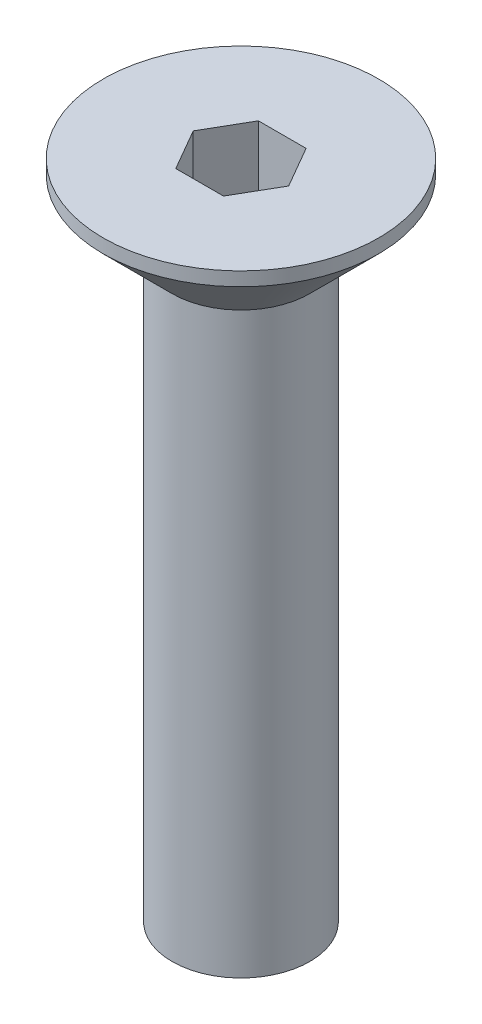
ISO-10303-21;
HEADER;
FILE_DESCRIPTION(('STEP AP214'),'2;1');
FILE_NAME('part.step','',(''),(''),'','','');
FILE_SCHEMA(('AUTOMOTIVE_DESIGN { 1 0 10303 214 1 1 1 1 }'));
ENDSEC;
DATA;
#1=APPLICATION_CONTEXT('core data for automotive mechanical design processes');
#2=APPLICATION_PROTOCOL_DEFINITION('international standard','automotive_design',2000,#1);
#3=PRODUCT_CONTEXT('',#1,'mechanical');
#4=PRODUCT('Part','Part','',(#3));
#5=PRODUCT_RELATED_PRODUCT_CATEGORY('part','',(#4));
#6=PRODUCT_DEFINITION_FORMATION('','',#4);
#7=PRODUCT_DEFINITION_CONTEXT('part definition',#1,'design');
#8=PRODUCT_DEFINITION('design','',#6,#7);
#9=PRODUCT_DEFINITION_SHAPE('','',#8);
#10=(LENGTH_UNIT() NAMED_UNIT(*) SI_UNIT(.MILLI.,.METRE.));
#11=(NAMED_UNIT(*) PLANE_ANGLE_UNIT() SI_UNIT($,.RADIAN.));
#12=(NAMED_UNIT(*) SI_UNIT($,.STERADIAN.) SOLID_ANGLE_UNIT());
#13=UNCERTAINTY_MEASURE_WITH_UNIT(LENGTH_MEASURE(1.E-05),#10,'distance_accuracy_value','');
#14=(GEOMETRIC_REPRESENTATION_CONTEXT(3) GLOBAL_UNCERTAINTY_ASSIGNED_CONTEXT((#13)) GLOBAL_UNIT_ASSIGNED_CONTEXT((#10,
#11,#12)) REPRESENTATION_CONTEXT('',''));
#15=CARTESIAN_POINT('',(0.,0.,0.));
#16=DIRECTION('',(0.,0.,1.));
#17=DIRECTION('',(1.,0.,0.));
#18=AXIS2_PLACEMENT_3D('',#15,#16,#17);
#19=CARTESIAN_POINT('',(2.50000000000001,0.,0.));
#20=DIRECTION('',(0.,-1.,0.));
#21=DIRECTION('',(0.,0.,-1.));
#22=AXIS2_PLACEMENT_3D('',#19,#20,#21);
#23=PLANE('',#22);
#24=DIRECTION('',(-1.,0.,0.));
#25=VECTOR('',#24,1.);
#26=CARTESIAN_POINT('',(0.433012701892219,0.,-0.75));
#27=LINE('',#26,#25);
#28=CARTESIAN_POINT('',(0.433012701892219,0.,-0.75));
#29=VERTEX_POINT('',#28);
#30=CARTESIAN_POINT('',(-0.433012701892219,0.,-0.75));
#31=VERTEX_POINT('',#30);
#32=EDGE_CURVE('E122',#29,#31,#27,.T.);
#33=ORIENTED_EDGE('',*,*,#32,.F.);
#34=DIRECTION('',(-0.5,0.,-0.866025403784438));
#35=VECTOR('',#34,1.);
#36=CARTESIAN_POINT('',(0.866025403784439,0.,0.));
#37=LINE('',#36,#35);
#38=CARTESIAN_POINT('',(0.866025403784439,0.,0.));
#39=VERTEX_POINT('',#38);
#40=EDGE_CURVE('E48',#39,#29,#37,.T.);
#41=ORIENTED_EDGE('',*,*,#40,.F.);
#42=DIRECTION('',(0.5,0.,-0.866025403784439));
#43=VECTOR('',#42,1.);
#44=CARTESIAN_POINT('',(0.43301270189222,0.,0.75));
#45=LINE('',#44,#43);
#46=CARTESIAN_POINT('',(0.43301270189222,0.,0.75));
#47=VERTEX_POINT('',#46);
#48=EDGE_CURVE('E131',#47,#39,#45,.T.);
#49=ORIENTED_EDGE('',*,*,#48,.F.);
#50=DIRECTION('',(1.,0.,0.));
#51=VECTOR('',#50,1.);
#52=CARTESIAN_POINT('',(-0.433012701892219,0.,0.75));
#53=LINE('',#52,#51);
#54=CARTESIAN_POINT('',(-0.433012701892219,0.,0.75));
#55=VERTEX_POINT('',#54);
#56=EDGE_CURVE('E129',#55,#47,#53,.T.);
#57=ORIENTED_EDGE('',*,*,#56,.F.);
#58=DIRECTION('',(0.5,0.,0.866025403784438));
#59=VECTOR('',#58,1.);
#60=CARTESIAN_POINT('',(-0.866025403784438,0.,0.));
#61=LINE('',#60,#59);
#62=CARTESIAN_POINT('',(-0.866025403784438,0.,0.));
#63=VERTEX_POINT('',#62);
#64=EDGE_CURVE('E96',#63,#55,#61,.T.);
#65=ORIENTED_EDGE('',*,*,#64,.F.);
#66=DIRECTION('',(-0.5,0.,0.866025403784439));
#67=VECTOR('',#66,1.);
#68=CARTESIAN_POINT('',(-0.433012701892219,0.,-0.75));
#69=LINE('',#68,#67);
#70=EDGE_CURVE('E125',#31,#63,#69,.T.);
#71=ORIENTED_EDGE('',*,*,#70,.F.);
#72=EDGE_LOOP('',(#33,#41,#49,#57,#65,#71));
#73=FACE_BOUND('',#72,.T.);
#74=CARTESIAN_POINT('',(0.,0.,0.));
#75=DIRECTION('',(0.,1.,0.));
#76=DIRECTION('',(0.,0.,1.));
#77=AXIS2_PLACEMENT_3D('',#74,#75,#76);
#78=CIRCLE('',#77,2.50000000000001);
#79=CARTESIAN_POINT('',(0.,0.,2.50000000000001));
#80=VERTEX_POINT('',#79);
#81=EDGE_CURVE('E11',#80,#80,#78,.T.);
#82=ORIENTED_EDGE('',*,*,#81,.T.);
#83=EDGE_LOOP('',(#82));
#84=FACE_BOUND('',#83,.T.);
#85=ADVANCED_FACE('F34',(#73,#84),#23,.F.);
#86=CARTESIAN_POINT('',(0.,61.6916426261037,0.));
#87=DIRECTION('',(0.,1.,0.));
#88=DIRECTION('',(0.,0.,1.));
#89=AXIS2_PLACEMENT_3D('',#86,#87,#88);
#90=CYLINDRICAL_SURFACE('',#89,2.50000000000001);
#91=ORIENTED_EDGE('',*,*,#81,.F.);
#92=EDGE_LOOP('',(#91));
#93=FACE_BOUND('',#92,.T.);
#94=CARTESIAN_POINT('',(0.,-0.249999999999986,0.));
#95=DIRECTION('',(0.,1.,0.));
#96=DIRECTION('',(0.,0.,1.));
#97=AXIS2_PLACEMENT_3D('',#94,#95,#96);
#98=CIRCLE('',#97,2.50000000000002);
#99=CARTESIAN_POINT('',(0.,-0.249999999999986,2.50000000000002));
#100=VERTEX_POINT('',#99);
#101=EDGE_CURVE('E41',#100,#100,#98,.T.);
#102=ORIENTED_EDGE('',*,*,#101,.T.);
#103=EDGE_LOOP('',(#102));
#104=FACE_BOUND('',#103,.T.);
#105=ADVANCED_FACE('F148',(#93,#104),#90,.T.);
#106=CARTESIAN_POINT('',(0.,-1.5,0.));
#107=DIRECTION('',(0.,1.,0.));
#108=DIRECTION('',(0.,0.,1.));
#109=AXIS2_PLACEMENT_3D('',#106,#107,#108);
#110=CONICAL_SURFACE('',#109,1.25000000000001,0.785398163397445);
#111=ORIENTED_EDGE('',*,*,#101,.F.);
#112=EDGE_LOOP('',(#111));
#113=FACE_BOUND('',#112,.T.);
#114=CARTESIAN_POINT('',(0.,-1.5,0.));
#115=DIRECTION('',(0.,1.,0.));
#116=DIRECTION('',(0.,0.,1.));
#117=AXIS2_PLACEMENT_3D('',#114,#115,#116);
#118=CIRCLE('',#117,1.25000000000001);
#119=CARTESIAN_POINT('',(0.,-1.5,1.25000000000001));
#120=VERTEX_POINT('',#119);
#121=EDGE_CURVE('E143',#120,#120,#118,.T.);
#122=ORIENTED_EDGE('',*,*,#121,.T.);
#123=EDGE_LOOP('',(#122));
#124=FACE_BOUND('',#123,.T.);
#125=ADVANCED_FACE('F150',(#113,#124),#110,.T.);
#126=CARTESIAN_POINT('',(0.,61.6916426261037,0.));
#127=DIRECTION('',(0.,1.,0.));
#128=DIRECTION('',(0.,0.,1.));
#129=AXIS2_PLACEMENT_3D('',#126,#127,#128);
#130=CYLINDRICAL_SURFACE('',#129,1.25000000000001);
#131=ORIENTED_EDGE('',*,*,#121,.F.);
#132=EDGE_LOOP('',(#131));
#133=FACE_BOUND('',#132,.T.);
#134=CARTESIAN_POINT('',(0.,-12.,0.));
#135=DIRECTION('',(0.,1.,0.));
#136=DIRECTION('',(0.,0.,1.));
#137=AXIS2_PLACEMENT_3D('',#134,#135,#136);
#138=CIRCLE('',#137,1.25000000000001);
#139=CARTESIAN_POINT('',(0.,-12.,1.25000000000001));
#140=VERTEX_POINT('',#139);
#141=EDGE_CURVE('E135',#140,#140,#138,.T.);
#142=ORIENTED_EDGE('',*,*,#141,.T.);
#143=EDGE_LOOP('',(#142));
#144=FACE_BOUND('',#143,.T.);
#145=ADVANCED_FACE('F153',(#133,#144),#130,.T.);
#146=CARTESIAN_POINT('',(0.,-12.,0.));
#147=DIRECTION('',(0.,1.,0.));
#148=DIRECTION('',(0.,0.,1.));
#149=AXIS2_PLACEMENT_3D('',#146,#147,#148);
#150=PLANE('',#149);
#151=ORIENTED_EDGE('',*,*,#141,.F.);
#152=EDGE_LOOP('',(#151));
#153=FACE_BOUND('',#152,.T.);
#154=ADVANCED_FACE('F159',(#153),#150,.F.);
#155=CARTESIAN_POINT('',(0.866025403784439,-1.5,0.));
#156=DIRECTION('',(0.866025403784439,0.,-0.5));
#157=DIRECTION('',(-0.5,0.,-0.866025403784439));
#158=AXIS2_PLACEMENT_3D('',#155,#156,#157);
#159=PLANE('',#158);
#160=ORIENTED_EDGE('',*,*,#40,.T.);
#161=DIRECTION('',(0.,1.,0.));
#162=VECTOR('',#161,1.);
#163=CARTESIAN_POINT('',(0.433012701892219,-1.5,-0.75));
#164=LINE('',#163,#162);
#165=CARTESIAN_POINT('',(0.433012701892219,-1.5,-0.75));
#166=VERTEX_POINT('',#165);
#167=EDGE_CURVE('E78',#166,#29,#164,.T.);
#168=ORIENTED_EDGE('',*,*,#167,.F.);
#169=DIRECTION('',(-0.5,0.,-0.866025403784438));
#170=VECTOR('',#169,1.);
#171=CARTESIAN_POINT('',(0.866025403784439,-1.5,0.));
#172=LINE('',#171,#170);
#173=CARTESIAN_POINT('',(0.866025403784439,-1.5,0.));
#174=VERTEX_POINT('',#173);
#175=EDGE_CURVE('E133',#174,#166,#172,.T.);
#176=ORIENTED_EDGE('',*,*,#175,.F.);
#177=DIRECTION('',(0.,1.,0.));
#178=VECTOR('',#177,1.);
#179=CARTESIAN_POINT('',(0.866025403784439,-1.5,0.));
#180=LINE('',#179,#178);
#181=EDGE_CURVE('E56',#174,#39,#180,.T.);
#182=ORIENTED_EDGE('',*,*,#181,.T.);
#183=EDGE_LOOP('',(#160,#168,#176,#182));
#184=FACE_BOUND('',#183,.T.);
#185=ADVANCED_FACE('F164',(#184),#159,.F.);
#186=CARTESIAN_POINT('',(0.43301270189222,-1.5,0.75));
#187=DIRECTION('',(0.866025403784439,0.,0.5));
#188=DIRECTION('',(0.5,0.,-0.866025403784439));
#189=AXIS2_PLACEMENT_3D('',#186,#187,#188);
#190=PLANE('',#189);
#191=ORIENTED_EDGE('',*,*,#48,.T.);
#192=ORIENTED_EDGE('',*,*,#181,.F.);
#193=DIRECTION('',(0.5,0.,-0.866025403784439));
#194=VECTOR('',#193,1.);
#195=CARTESIAN_POINT('',(0.43301270189222,-1.5,0.75));
#196=LINE('',#195,#194);
#197=CARTESIAN_POINT('',(0.43301270189222,-1.5,0.75));
#198=VERTEX_POINT('',#197);
#199=EDGE_CURVE('E108',#198,#174,#196,.T.);
#200=ORIENTED_EDGE('',*,*,#199,.F.);
#201=DIRECTION('',(0.,1.,0.));
#202=VECTOR('',#201,1.);
#203=CARTESIAN_POINT('',(0.43301270189222,-1.5,0.75));
#204=LINE('',#203,#202);
#205=EDGE_CURVE('E100',#198,#47,#204,.T.);
#206=ORIENTED_EDGE('',*,*,#205,.T.);
#207=EDGE_LOOP('',(#191,#192,#200,#206));
#208=FACE_BOUND('',#207,.T.);
#209=ADVANCED_FACE('F169',(#208),#190,.F.);
#210=CARTESIAN_POINT('',(-0.433012701892219,-1.5,0.75));
#211=DIRECTION('',(0.,0.,1.));
#212=DIRECTION('',(1.,0.,0.));
#213=AXIS2_PLACEMENT_3D('',#210,#211,#212);
#214=PLANE('',#213);
#215=ORIENTED_EDGE('',*,*,#56,.T.);
#216=ORIENTED_EDGE('',*,*,#205,.F.);
#217=DIRECTION('',(1.,0.,0.));
#218=VECTOR('',#217,1.);
#219=CARTESIAN_POINT('',(-0.433012701892219,-1.5,0.75));
#220=LINE('',#219,#218);
#221=CARTESIAN_POINT('',(-0.433012701892219,-1.5,0.75));
#222=VERTEX_POINT('',#221);
#223=EDGE_CURVE('E104',#222,#198,#220,.T.);
#224=ORIENTED_EDGE('',*,*,#223,.F.);
#225=DIRECTION('',(0.,1.,0.));
#226=VECTOR('',#225,1.);
#227=CARTESIAN_POINT('',(-0.433012701892219,-1.5,0.75));
#228=LINE('',#227,#226);
#229=EDGE_CURVE('E89',#222,#55,#228,.T.);
#230=ORIENTED_EDGE('',*,*,#229,.T.);
#231=EDGE_LOOP('',(#215,#216,#224,#230));
#232=FACE_BOUND('',#231,.T.);
#233=ADVANCED_FACE('F105',(#232),#214,.F.);
#234=CARTESIAN_POINT('',(-0.866025403784438,-1.5,0.));
#235=DIRECTION('',(-0.866025403784438,0.,0.5));
#236=DIRECTION('',(0.5,0.,0.866025403784439));
#237=AXIS2_PLACEMENT_3D('',#234,#235,#236);
#238=PLANE('',#237);
#239=ORIENTED_EDGE('',*,*,#64,.T.);
#240=ORIENTED_EDGE('',*,*,#229,.F.);
#241=DIRECTION('',(0.5,0.,0.866025403784438));
#242=VECTOR('',#241,1.);
#243=CARTESIAN_POINT('',(-0.866025403784438,-1.5,0.));
#244=LINE('',#243,#242);
#245=CARTESIAN_POINT('',(-0.866025403784438,-1.5,0.));
#246=VERTEX_POINT('',#245);
#247=EDGE_CURVE('E93',#246,#222,#244,.T.);
#248=ORIENTED_EDGE('',*,*,#247,.F.);
#249=DIRECTION('',(0.,1.,0.));
#250=VECTOR('',#249,1.);
#251=CARTESIAN_POINT('',(-0.866025403784438,-1.5,0.));
#252=LINE('',#251,#250);
#253=EDGE_CURVE('E101',#246,#63,#252,.T.);
#254=ORIENTED_EDGE('',*,*,#253,.T.);
#255=EDGE_LOOP('',(#239,#240,#248,#254));
#256=FACE_BOUND('',#255,.T.);
#257=ADVANCED_FACE('F91',(#256),#238,.F.);
#258=CARTESIAN_POINT('',(-0.433012701892219,-1.5,-0.75));
#259=DIRECTION('',(-0.866025403784439,0.,-0.5));
#260=DIRECTION('',(-0.5,0.,0.866025403784439));
#261=AXIS2_PLACEMENT_3D('',#258,#259,#260);
#262=PLANE('',#261);
#263=ORIENTED_EDGE('',*,*,#70,.T.);
#264=ORIENTED_EDGE('',*,*,#253,.F.);
#265=DIRECTION('',(-0.5,0.,0.866025403784439));
#266=VECTOR('',#265,1.);
#267=CARTESIAN_POINT('',(-0.433012701892219,-1.5,-0.75));
#268=LINE('',#267,#266);
#269=CARTESIAN_POINT('',(-0.433012701892219,-1.5,-0.75));
#270=VERTEX_POINT('',#269);
#271=EDGE_CURVE('E114',#270,#246,#268,.T.);
#272=ORIENTED_EDGE('',*,*,#271,.F.);
#273=DIRECTION('',(0.,1.,0.));
#274=VECTOR('',#273,1.);
#275=CARTESIAN_POINT('',(-0.433012701892219,-1.5,-0.75));
#276=LINE('',#275,#274);
#277=EDGE_CURVE('E138',#270,#31,#276,.T.);
#278=ORIENTED_EDGE('',*,*,#277,.T.);
#279=EDGE_LOOP('',(#263,#264,#272,#278));
#280=FACE_BOUND('',#279,.T.);
#281=ADVANCED_FACE('F195',(#280),#262,.F.);
#282=CARTESIAN_POINT('',(0.433012701892219,-1.5,-0.75));
#283=DIRECTION('',(0.,0.,-1.));
#284=DIRECTION('',(-1.,0.,0.));
#285=AXIS2_PLACEMENT_3D('',#282,#283,#284);
#286=PLANE('',#285);
#287=ORIENTED_EDGE('',*,*,#32,.T.);
#288=ORIENTED_EDGE('',*,*,#277,.F.);
#289=DIRECTION('',(-1.,0.,0.));
#290=VECTOR('',#289,1.);
#291=CARTESIAN_POINT('',(0.433012701892219,-1.5,-0.75));
#292=LINE('',#291,#290);
#293=EDGE_CURVE('E116',#166,#270,#292,.T.);
#294=ORIENTED_EDGE('',*,*,#293,.F.);
#295=ORIENTED_EDGE('',*,*,#167,.T.);
#296=EDGE_LOOP('',(#287,#288,#294,#295));
#297=FACE_BOUND('',#296,.T.);
#298=ADVANCED_FACE('F183',(#297),#286,.F.);
#299=CARTESIAN_POINT('',(0.866025403784439,-1.5,0.));
#300=DIRECTION('',(0.,-1.,0.));
#301=DIRECTION('',(0.,0.,-1.));
#302=AXIS2_PLACEMENT_3D('',#299,#300,#301);
#303=PLANE('',#302);
#304=ORIENTED_EDGE('',*,*,#175,.T.);
#305=ORIENTED_EDGE('',*,*,#293,.T.);
#306=ORIENTED_EDGE('',*,*,#271,.T.);
#307=ORIENTED_EDGE('',*,*,#247,.T.);
#308=ORIENTED_EDGE('',*,*,#223,.T.);
#309=ORIENTED_EDGE('',*,*,#199,.T.);
#310=EDGE_LOOP('',(#304,#305,#306,#307,#308,#309));
#311=FACE_BOUND('',#310,.T.);
#312=ADVANCED_FACE('F111',(#311),#303,.F.);
#313=CLOSED_SHELL('',(#85,#105,#125,#145,#154,#185,#209,#233,#257,#281,#298,#312));
#314=MANIFOLD_SOLID_BREP('B2',#313);
#315=ADVANCED_BREP_SHAPE_REPRESENTATION('',(#18,#314),#14);
#316=SHAPE_DEFINITION_REPRESENTATION(#9,#315);
ENDSEC;
END-ISO-10303-21;
